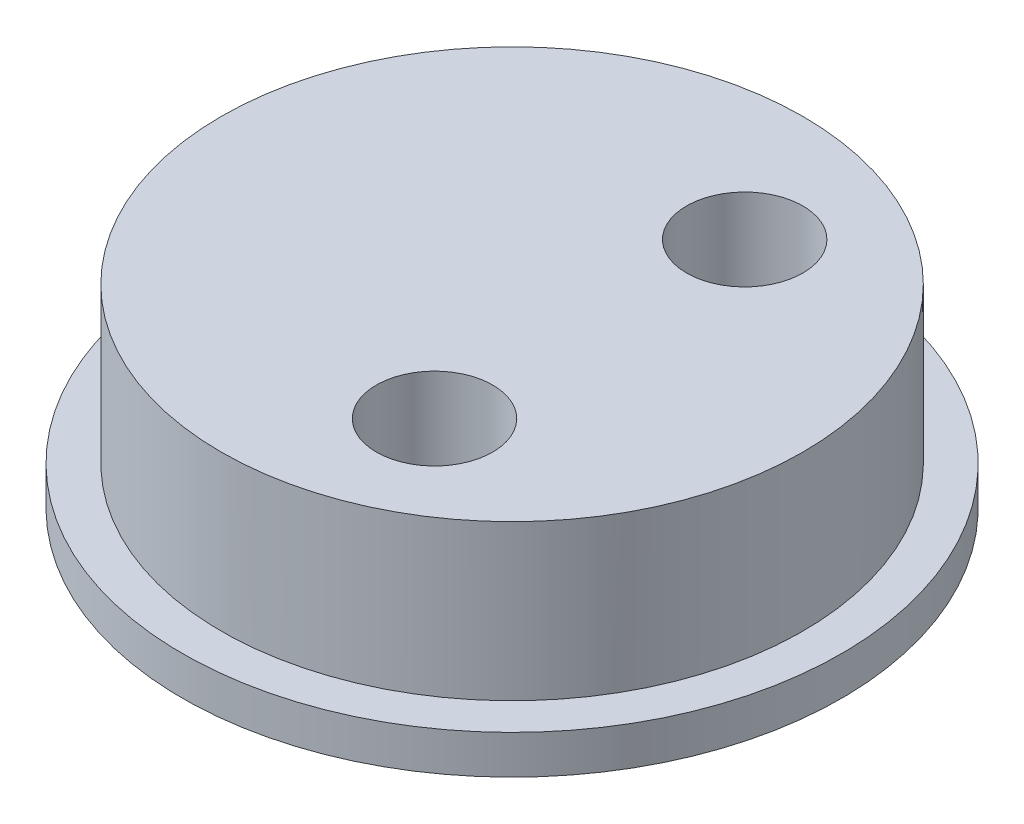
ISO-10303-21;
HEADER;
FILE_DESCRIPTION(('STEP AP214'),'2;1');
FILE_NAME('part.step','',(''),(''),'','','');
FILE_SCHEMA(('AUTOMOTIVE_DESIGN { 1 0 10303 214 1 1 1 1 }'));
ENDSEC;
DATA;
#1=APPLICATION_CONTEXT('core data for automotive mechanical design processes');
#2=APPLICATION_PROTOCOL_DEFINITION('international standard','automotive_design',2000,#1);
#3=PRODUCT_CONTEXT('',#1,'mechanical');
#4=PRODUCT('Part','Part','',(#3));
#5=PRODUCT_RELATED_PRODUCT_CATEGORY('part','',(#4));
#6=PRODUCT_DEFINITION_FORMATION('','',#4);
#7=PRODUCT_DEFINITION_CONTEXT('part definition',#1,'design');
#8=PRODUCT_DEFINITION('design','',#6,#7);
#9=PRODUCT_DEFINITION_SHAPE('','',#8);
#10=(LENGTH_UNIT() NAMED_UNIT(*) SI_UNIT(.MILLI.,.METRE.));
#11=(NAMED_UNIT(*) PLANE_ANGLE_UNIT() SI_UNIT($,.RADIAN.));
#12=(NAMED_UNIT(*) SI_UNIT($,.STERADIAN.) SOLID_ANGLE_UNIT());
#13=UNCERTAINTY_MEASURE_WITH_UNIT(LENGTH_MEASURE(1.E-05),#10,'distance_accuracy_value','');
#14=(GEOMETRIC_REPRESENTATION_CONTEXT(3) GLOBAL_UNCERTAINTY_ASSIGNED_CONTEXT((#13)) GLOBAL_UNIT_ASSIGNED_CONTEXT((#10,
#11,#12)) REPRESENTATION_CONTEXT('',''));
#15=CARTESIAN_POINT('',(0.,0.,0.));
#16=DIRECTION('',(0.,0.,1.));
#17=DIRECTION('',(1.,0.,0.));
#18=AXIS2_PLACEMENT_3D('',#15,#16,#17);
#19=CARTESIAN_POINT('',(-2.,5.,0.));
#20=DIRECTION('',(0.,-1.,0.));
#21=DIRECTION('',(0.,0.,-1.));
#22=AXIS2_PLACEMENT_3D('',#19,#20,#21);
#23=CYLINDRICAL_SURFACE('',#22,7.5);
#24=CARTESIAN_POINT('',(-2.,5.,0.));
#25=DIRECTION('',(0.,1.,0.));
#26=DIRECTION('',(0.,0.,1.));
#27=AXIS2_PLACEMENT_3D('',#24,#25,#26);
#28=CIRCLE('',#27,7.5);
#29=CARTESIAN_POINT('',(-2.,5.,7.5));
#30=VERTEX_POINT('',#29);
#31=EDGE_CURVE('E37',#30,#30,#28,.T.);
#32=ORIENTED_EDGE('',*,*,#31,.F.);
#33=EDGE_LOOP('',(#32));
#34=FACE_BOUND('',#33,.T.);
#35=CARTESIAN_POINT('',(-2.,1.,0.));
#36=DIRECTION('',(0.,-1.,0.));
#37=DIRECTION('',(0.,0.,-1.));
#38=AXIS2_PLACEMENT_3D('',#35,#36,#37);
#39=CIRCLE('',#38,7.5);
#40=CARTESIAN_POINT('',(-2.,1.,-7.5));
#41=VERTEX_POINT('',#40);
#42=EDGE_CURVE('E10',#41,#41,#39,.T.);
#43=ORIENTED_EDGE('',*,*,#42,.F.);
#44=EDGE_LOOP('',(#43));
#45=FACE_BOUND('',#44,.T.);
#46=ADVANCED_FACE('F31',(#34,#45),#23,.T.);
#47=CARTESIAN_POINT('',(-2.,5.,0.));
#48=DIRECTION('',(0.,1.,0.));
#49=DIRECTION('',(0.,0.,1.));
#50=AXIS2_PLACEMENT_3D('',#47,#48,#49);
#51=PLANE('',#50);
#52=CARTESIAN_POINT('',(0.,5.,-4.));
#53=DIRECTION('',(0.,1.,0.));
#54=DIRECTION('',(0.,0.,1.));
#55=AXIS2_PLACEMENT_3D('',#52,#53,#54);
#56=CIRCLE('',#55,1.5);
#57=CARTESIAN_POINT('',(0.,5.,-2.5));
#58=VERTEX_POINT('',#57);
#59=EDGE_CURVE('E57',#58,#58,#56,.T.);
#60=ORIENTED_EDGE('',*,*,#59,.F.);
#61=EDGE_LOOP('',(#60));
#62=FACE_BOUND('',#61,.T.);
#63=CARTESIAN_POINT('',(0.,5.,4.));
#64=DIRECTION('',(0.,1.,0.));
#65=DIRECTION('',(0.,0.,1.));
#66=AXIS2_PLACEMENT_3D('',#63,#64,#65);
#67=CIRCLE('',#66,1.5);
#68=CARTESIAN_POINT('',(0.,5.,5.5));
#69=VERTEX_POINT('',#68);
#70=EDGE_CURVE('E51',#69,#69,#67,.T.);
#71=ORIENTED_EDGE('',*,*,#70,.F.);
#72=EDGE_LOOP('',(#71));
#73=FACE_BOUND('',#72,.T.);
#74=ORIENTED_EDGE('',*,*,#31,.T.);
#75=EDGE_LOOP('',(#74));
#76=FACE_BOUND('',#75,.T.);
#77=ADVANCED_FACE('F73',(#62,#73,#76),#51,.T.);
#78=CARTESIAN_POINT('',(-2.,1.,0.));
#79=DIRECTION('',(0.,-1.,0.));
#80=DIRECTION('',(0.,0.,-1.));
#81=AXIS2_PLACEMENT_3D('',#78,#79,#80);
#82=CYLINDRICAL_SURFACE('',#81,8.5);
#83=CARTESIAN_POINT('',(-2.,1.,0.));
#84=DIRECTION('',(0.,-1.,0.));
#85=DIRECTION('',(0.,0.,-1.));
#86=AXIS2_PLACEMENT_3D('',#83,#84,#85);
#87=CIRCLE('',#86,8.5);
#88=CARTESIAN_POINT('',(-2.,1.,-8.5));
#89=VERTEX_POINT('',#88);
#90=EDGE_CURVE('E41',#89,#89,#87,.T.);
#91=ORIENTED_EDGE('',*,*,#90,.T.);
#92=EDGE_LOOP('',(#91));
#93=FACE_BOUND('',#92,.T.);
#94=CARTESIAN_POINT('',(-2.,0.,0.));
#95=DIRECTION('',(0.,-1.,0.));
#96=DIRECTION('',(0.,0.,-1.));
#97=AXIS2_PLACEMENT_3D('',#94,#95,#96);
#98=CIRCLE('',#97,8.5);
#99=CARTESIAN_POINT('',(-2.,0.,-8.5));
#100=VERTEX_POINT('',#99);
#101=EDGE_CURVE('E45',#100,#100,#98,.T.);
#102=ORIENTED_EDGE('',*,*,#101,.F.);
#103=EDGE_LOOP('',(#102));
#104=FACE_BOUND('',#103,.T.);
#105=ADVANCED_FACE('F76',(#93,#104),#82,.T.);
#106=CARTESIAN_POINT('',(-2.,1.,0.));
#107=DIRECTION('',(0.,-1.,0.));
#108=DIRECTION('',(0.,0.,-1.));
#109=AXIS2_PLACEMENT_3D('',#106,#107,#108);
#110=PLANE('',#109);
#111=ORIENTED_EDGE('',*,*,#42,.T.);
#112=EDGE_LOOP('',(#111));
#113=FACE_BOUND('',#112,.T.);
#114=ORIENTED_EDGE('',*,*,#90,.F.);
#115=EDGE_LOOP('',(#114));
#116=FACE_BOUND('',#115,.T.);
#117=ADVANCED_FACE('F86',(#113,#116),#110,.F.);
#118=CARTESIAN_POINT('',(-2.,0.,0.));
#119=DIRECTION('',(0.,1.,0.));
#120=DIRECTION('',(0.,0.,1.));
#121=AXIS2_PLACEMENT_3D('',#118,#119,#120);
#122=PLANE('',#121);
#123=CARTESIAN_POINT('',(0.,0.,-4.));
#124=DIRECTION('',(0.,1.,0.));
#125=DIRECTION('',(0.,0.,1.));
#126=AXIS2_PLACEMENT_3D('',#123,#124,#125);
#127=CIRCLE('',#126,1.5);
#128=CARTESIAN_POINT('',(0.,0.,-2.5));
#129=VERTEX_POINT('',#128);
#130=EDGE_CURVE('E49',#129,#129,#127,.T.);
#131=ORIENTED_EDGE('',*,*,#130,.T.);
#132=EDGE_LOOP('',(#131));
#133=FACE_BOUND('',#132,.T.);
#134=CARTESIAN_POINT('',(0.,0.,4.));
#135=DIRECTION('',(0.,1.,0.));
#136=DIRECTION('',(0.,0.,1.));
#137=AXIS2_PLACEMENT_3D('',#134,#135,#136);
#138=CIRCLE('',#137,1.5);
#139=CARTESIAN_POINT('',(0.,0.,5.5));
#140=VERTEX_POINT('',#139);
#141=EDGE_CURVE('E54',#140,#140,#138,.T.);
#142=ORIENTED_EDGE('',*,*,#141,.T.);
#143=EDGE_LOOP('',(#142));
#144=FACE_BOUND('',#143,.T.);
#145=ORIENTED_EDGE('',*,*,#101,.T.);
#146=EDGE_LOOP('',(#145));
#147=FACE_BOUND('',#146,.T.);
#148=ADVANCED_FACE('F63',(#133,#144,#147),#122,.F.);
#149=CARTESIAN_POINT('',(0.,0.,4.));
#150=DIRECTION('',(0.,1.,0.));
#151=DIRECTION('',(0.,0.,1.));
#152=AXIS2_PLACEMENT_3D('',#149,#150,#151);
#153=CYLINDRICAL_SURFACE('',#152,1.5);
#154=ORIENTED_EDGE('',*,*,#141,.F.);
#155=EDGE_LOOP('',(#154));
#156=FACE_BOUND('',#155,.T.);
#157=ORIENTED_EDGE('',*,*,#70,.T.);
#158=EDGE_LOOP('',(#157));
#159=FACE_BOUND('',#158,.T.);
#160=ADVANCED_FACE('F69',(#156,#159),#153,.F.);
#161=CARTESIAN_POINT('',(0.,0.,-4.));
#162=DIRECTION('',(0.,1.,0.));
#163=DIRECTION('',(0.,0.,1.));
#164=AXIS2_PLACEMENT_3D('',#161,#162,#163);
#165=CYLINDRICAL_SURFACE('',#164,1.5);
#166=ORIENTED_EDGE('',*,*,#130,.F.);
#167=EDGE_LOOP('',(#166));
#168=FACE_BOUND('',#167,.T.);
#169=ORIENTED_EDGE('',*,*,#59,.T.);
#170=EDGE_LOOP('',(#169));
#171=FACE_BOUND('',#170,.T.);
#172=ADVANCED_FACE('F66',(#168,#171),#165,.F.);
#173=CLOSED_SHELL('',(#46,#77,#105,#117,#148,#160,#172));
#174=MANIFOLD_SOLID_BREP('B2',#173);
#175=ADVANCED_BREP_SHAPE_REPRESENTATION('',(#18,#174),#14);
#176=SHAPE_DEFINITION_REPRESENTATION(#9,#175);
ENDSEC;
END-ISO-10303-21;
